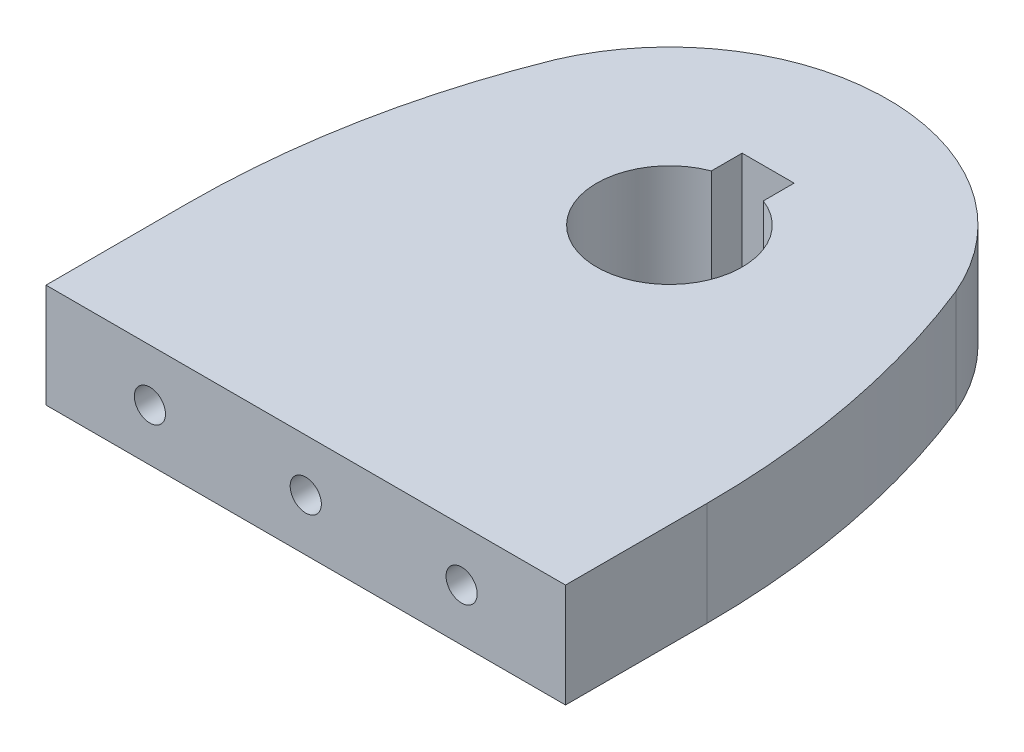
ISO-10303-21;
HEADER;
FILE_DESCRIPTION(('STEP AP214'),'2;1');
FILE_NAME('part.step','',(''),(''),'','','');
FILE_SCHEMA(('AUTOMOTIVE_DESIGN { 1 0 10303 214 1 1 1 1 }'));
ENDSEC;
DATA;
#1=APPLICATION_CONTEXT('core data for automotive mechanical design processes');
#2=APPLICATION_PROTOCOL_DEFINITION('international standard','automotive_design',2000,#1);
#3=PRODUCT_CONTEXT('',#1,'mechanical');
#4=PRODUCT('Part','Part','',(#3));
#5=PRODUCT_RELATED_PRODUCT_CATEGORY('part','',(#4));
#6=PRODUCT_DEFINITION_FORMATION('','',#4);
#7=PRODUCT_DEFINITION_CONTEXT('part definition',#1,'design');
#8=PRODUCT_DEFINITION('design','',#6,#7);
#9=PRODUCT_DEFINITION_SHAPE('','',#8);
#10=(LENGTH_UNIT() NAMED_UNIT(*) SI_UNIT(.MILLI.,.METRE.));
#11=(NAMED_UNIT(*) PLANE_ANGLE_UNIT() SI_UNIT($,.RADIAN.));
#12=(NAMED_UNIT(*) SI_UNIT($,.STERADIAN.) SOLID_ANGLE_UNIT());
#13=UNCERTAINTY_MEASURE_WITH_UNIT(LENGTH_MEASURE(1.E-05),#10,'distance_accuracy_value','');
#14=(GEOMETRIC_REPRESENTATION_CONTEXT(3) GLOBAL_UNCERTAINTY_ASSIGNED_CONTEXT((#13)) GLOBAL_UNIT_ASSIGNED_CONTEXT((#10,
#11,#12)) REPRESENTATION_CONTEXT('',''));
#15=CARTESIAN_POINT('',(0.,0.,0.));
#16=DIRECTION('',(0.,0.,1.));
#17=DIRECTION('',(1.,0.,0.));
#18=AXIS2_PLACEMENT_3D('',#15,#16,#17);
#19=CARTESIAN_POINT('',(0.,10.,-20.));
#20=DIRECTION('',(0.,-1.,0.));
#21=DIRECTION('',(0.,0.,-1.));
#22=AXIS2_PLACEMENT_3D('',#19,#20,#21);
#23=CYLINDRICAL_SURFACE('',#22,21.);
#24=CARTESIAN_POINT('',(0.,0.,-20.));
#25=DIRECTION('',(0.,1.,0.));
#26=DIRECTION('',(0.,0.,1.));
#27=AXIS2_PLACEMENT_3D('',#24,#25,#26);
#28=CIRCLE('',#27,21.);
#29=CARTESIAN_POINT('',(19.2968729091602,0.,-28.2843645458008));
#30=VERTEX_POINT('',#29);
#31=CARTESIAN_POINT('',(-19.2968729091602,0.,-28.2843645458008));
#32=VERTEX_POINT('',#31);
#33=EDGE_CURVE('E169',#30,#32,#28,.T.);
#34=ORIENTED_EDGE('',*,*,#33,.T.);
#35=DIRECTION('',(0.,-1.,0.));
#36=VECTOR('',#35,1.);
#37=CARTESIAN_POINT('',(-19.2968729091602,10.,-28.2843645458008));
#38=LINE('',#37,#36);
#39=CARTESIAN_POINT('',(-19.2968729091602,10.,-28.2843645458008));
#40=VERTEX_POINT('',#39);
#41=EDGE_CURVE('E196',#40,#32,#38,.T.);
#42=ORIENTED_EDGE('',*,*,#41,.F.);
#43=CARTESIAN_POINT('',(0.,10.,-20.));
#44=DIRECTION('',(0.,1.,0.));
#45=DIRECTION('',(0.,0.,1.));
#46=AXIS2_PLACEMENT_3D('',#43,#44,#45);
#47=CIRCLE('',#46,21.);
#48=CARTESIAN_POINT('',(19.2968729091602,10.,-28.2843645458008));
#49=VERTEX_POINT('',#48);
#50=EDGE_CURVE('E172',#49,#40,#47,.T.);
#51=ORIENTED_EDGE('',*,*,#50,.F.);
#52=DIRECTION('',(0.,-1.,0.));
#53=VECTOR('',#52,1.);
#54=CARTESIAN_POINT('',(19.2968729091602,10.,-28.2843645458008));
#55=LINE('',#54,#53);
#56=EDGE_CURVE('E199',#49,#30,#55,.T.);
#57=ORIENTED_EDGE('',*,*,#56,.T.);
#58=EDGE_LOOP('',(#34,#42,#51,#57));
#59=FACE_BOUND('',#58,.T.);
#60=ADVANCED_FACE('F38',(#59),#23,.T.);
#61=CARTESIAN_POINT('',(-25.,10.,0.));
#62=DIRECTION('',(1.,0.,0.));
#63=DIRECTION('',(0.,0.,-1.));
#64=AXIS2_PLACEMENT_3D('',#61,#62,#63);
#65=PLANE('',#64);
#66=DIRECTION('',(0.,0.,1.));
#67=VECTOR('',#66,1.);
#68=CARTESIAN_POINT('',(-25.,10.,0.));
#69=LINE('',#68,#67);
#70=CARTESIAN_POINT('',(-25.,10.,1.38000256223143));
#71=VERTEX_POINT('',#70);
#72=CARTESIAN_POINT('',(-25.,10.,15.));
#73=VERTEX_POINT('',#72);
#74=EDGE_CURVE('E174',#71,#73,#69,.T.);
#75=ORIENTED_EDGE('',*,*,#74,.F.);
#76=DIRECTION('',(0.,-1.,0.));
#77=VECTOR('',#76,1.);
#78=CARTESIAN_POINT('',(-25.,10.,1.38000256223143));
#79=LINE('',#78,#77);
#80=CARTESIAN_POINT('',(-25.,0.,1.38000256223143));
#81=VERTEX_POINT('',#80);
#82=EDGE_CURVE('E11',#71,#81,#79,.T.);
#83=ORIENTED_EDGE('',*,*,#82,.T.);
#84=DIRECTION('',(0.,0.,1.));
#85=VECTOR('',#84,1.);
#86=CARTESIAN_POINT('',(-25.,0.,0.));
#87=LINE('',#86,#85);
#88=CARTESIAN_POINT('',(-25.,0.,15.));
#89=VERTEX_POINT('',#88);
#90=EDGE_CURVE('E185',#81,#89,#87,.T.);
#91=ORIENTED_EDGE('',*,*,#90,.T.);
#92=DIRECTION('',(0.,-1.,0.));
#93=VECTOR('',#92,1.);
#94=CARTESIAN_POINT('',(-25.,10.,15.));
#95=LINE('',#94,#93);
#96=EDGE_CURVE('E193',#73,#89,#95,.T.);
#97=ORIENTED_EDGE('',*,*,#96,.F.);
#98=EDGE_LOOP('',(#75,#83,#91,#97));
#99=FACE_BOUND('',#98,.T.);
#100=ADVANCED_FACE('F222',(#99),#65,.F.);
#101=CARTESIAN_POINT('',(0.,10.,15.));
#102=DIRECTION('',(0.,0.,-1.));
#103=DIRECTION('',(-1.,0.,0.));
#104=AXIS2_PLACEMENT_3D('',#101,#102,#103);
#105=PLANE('',#104);
#106=CARTESIAN_POINT('',(15.,5.,15.));
#107=DIRECTION('',(0.,0.,1.));
#108=DIRECTION('',(1.,0.,0.));
#109=AXIS2_PLACEMENT_3D('',#106,#107,#108);
#110=CIRCLE('',#109,1.5);
#111=CARTESIAN_POINT('',(16.5,5.,15.));
#112=VERTEX_POINT('',#111);
#113=EDGE_CURVE('E153',#112,#112,#110,.T.);
#114=ORIENTED_EDGE('',*,*,#113,.F.);
#115=EDGE_LOOP('',(#114));
#116=FACE_BOUND('',#115,.T.);
#117=CARTESIAN_POINT('',(-15.,5.,15.));
#118=DIRECTION('',(0.,0.,1.));
#119=DIRECTION('',(1.,0.,0.));
#120=AXIS2_PLACEMENT_3D('',#117,#118,#119);
#121=CIRCLE('',#120,1.5);
#122=CARTESIAN_POINT('',(-13.5,5.,15.));
#123=VERTEX_POINT('',#122);
#124=EDGE_CURVE('E161',#123,#123,#121,.T.);
#125=ORIENTED_EDGE('',*,*,#124,.F.);
#126=EDGE_LOOP('',(#125));
#127=FACE_BOUND('',#126,.T.);
#128=CARTESIAN_POINT('',(0.,5.,15.));
#129=DIRECTION('',(0.,0.,1.));
#130=DIRECTION('',(1.,0.,0.));
#131=AXIS2_PLACEMENT_3D('',#128,#129,#130);
#132=CIRCLE('',#131,1.5);
#133=CARTESIAN_POINT('',(1.5,5.,15.));
#134=VERTEX_POINT('',#133);
#135=EDGE_CURVE('E160',#134,#134,#132,.T.);
#136=ORIENTED_EDGE('',*,*,#135,.F.);
#137=EDGE_LOOP('',(#136));
#138=FACE_BOUND('',#137,.T.);
#139=DIRECTION('',(1.,0.,0.));
#140=VECTOR('',#139,1.);
#141=CARTESIAN_POINT('',(0.,0.,15.));
#142=LINE('',#141,#140);
#143=CARTESIAN_POINT('',(25.,0.,15.));
#144=VERTEX_POINT('',#143);
#145=EDGE_CURVE('E187',#89,#144,#142,.T.);
#146=ORIENTED_EDGE('',*,*,#145,.T.);
#147=DIRECTION('',(0.,-1.,0.));
#148=VECTOR('',#147,1.);
#149=CARTESIAN_POINT('',(25.,10.,15.));
#150=LINE('',#149,#148);
#151=CARTESIAN_POINT('',(25.,10.,15.));
#152=VERTEX_POINT('',#151);
#153=EDGE_CURVE('E182',#152,#144,#150,.T.);
#154=ORIENTED_EDGE('',*,*,#153,.F.);
#155=DIRECTION('',(1.,0.,0.));
#156=VECTOR('',#155,1.);
#157=CARTESIAN_POINT('',(0.,10.,15.));
#158=LINE('',#157,#156);
#159=EDGE_CURVE('E177',#73,#152,#158,.T.);
#160=ORIENTED_EDGE('',*,*,#159,.F.);
#161=ORIENTED_EDGE('',*,*,#96,.T.);
#162=EDGE_LOOP('',(#146,#154,#160,#161));
#163=FACE_BOUND('',#162,.T.);
#164=ADVANCED_FACE('F227',(#116,#127,#138,#163),#105,.F.);
#165=CARTESIAN_POINT('',(25.,10.,0.));
#166=DIRECTION('',(1.,0.,0.));
#167=DIRECTION('',(0.,0.,-1.));
#168=AXIS2_PLACEMENT_3D('',#165,#166,#167);
#169=PLANE('',#168);
#170=DIRECTION('',(0.,0.,1.));
#171=VECTOR('',#170,1.);
#172=CARTESIAN_POINT('',(25.,0.,0.));
#173=LINE('',#172,#171);
#174=CARTESIAN_POINT('',(25.,0.,1.38000256223146));
#175=VERTEX_POINT('',#174);
#176=EDGE_CURVE('E175',#175,#144,#173,.T.);
#177=ORIENTED_EDGE('',*,*,#176,.F.);
#178=DIRECTION('',(0.,1.,0.));
#179=VECTOR('',#178,1.);
#180=CARTESIAN_POINT('',(25.,10.,1.38000256223146));
#181=LINE('',#180,#179);
#182=CARTESIAN_POINT('',(25.,10.,1.38000256223146));
#183=VERTEX_POINT('',#182);
#184=EDGE_CURVE('E61',#175,#183,#181,.T.);
#185=ORIENTED_EDGE('',*,*,#184,.T.);
#186=DIRECTION('',(0.,0.,1.));
#187=VECTOR('',#186,1.);
#188=CARTESIAN_POINT('',(25.,10.,0.));
#189=LINE('',#188,#187);
#190=EDGE_CURVE('E180',#183,#152,#189,.T.);
#191=ORIENTED_EDGE('',*,*,#190,.T.);
#192=ORIENTED_EDGE('',*,*,#153,.T.);
#193=EDGE_LOOP('',(#177,#185,#191,#192));
#194=FACE_BOUND('',#193,.T.);
#195=ADVANCED_FACE('F229',(#194),#169,.T.);
#196=CARTESIAN_POINT('',(0.,10.,0.));
#197=DIRECTION('',(0.,1.,0.));
#198=DIRECTION('',(0.,0.,1.));
#199=AXIS2_PLACEMENT_3D('',#196,#197,#198);
#200=PLANE('',#199);
#201=ORIENTED_EDGE('',*,*,#190,.F.);
#202=CARTESIAN_POINT('',(-55.,10.,1.38000256223148));
#203=DIRECTION('',(0.,1.,0.));
#204=DIRECTION('',(0.,0.,1.));
#205=AXIS2_PLACEMENT_3D('',#202,#203,#204);
#206=CIRCLE('',#205,80.);
#207=EDGE_CURVE('E46',#183,#49,#206,.T.);
#208=ORIENTED_EDGE('',*,*,#207,.T.);
#209=ORIENTED_EDGE('',*,*,#50,.T.);
#210=CARTESIAN_POINT('',(55.,10.,1.38000256223141));
#211=DIRECTION('',(0.,1.,0.));
#212=DIRECTION('',(0.,0.,1.));
#213=AXIS2_PLACEMENT_3D('',#210,#211,#212);
#214=CIRCLE('',#213,80.);
#215=EDGE_CURVE('E53',#40,#71,#214,.T.);
#216=ORIENTED_EDGE('',*,*,#215,.T.);
#217=ORIENTED_EDGE('',*,*,#74,.T.);
#218=ORIENTED_EDGE('',*,*,#159,.T.);
#219=EDGE_LOOP('',(#201,#208,#209,#216,#217,#218));
#220=FACE_BOUND('',#219,.T.);
#221=CARTESIAN_POINT('',(0.,10.,-20.));
#222=DIRECTION('',(0.,1.,0.));
#223=DIRECTION('',(0.,0.,1.));
#224=AXIS2_PLACEMENT_3D('',#221,#222,#223);
#225=CIRCLE('',#224,7.);
#226=CARTESIAN_POINT('',(-2.5,10.,-26.538348415311));
#227=VERTEX_POINT('',#226);
#228=CARTESIAN_POINT('',(2.5,10.,-26.538348415311));
#229=VERTEX_POINT('',#228);
#230=EDGE_CURVE('E122',#227,#229,#225,.T.);
#231=ORIENTED_EDGE('',*,*,#230,.F.);
#232=DIRECTION('',(0.,0.,1.));
#233=VECTOR('',#232,1.);
#234=CARTESIAN_POINT('',(-2.5,10.,0.));
#235=LINE('',#234,#233);
#236=CARTESIAN_POINT('',(-2.5,10.,-29.5));
#237=VERTEX_POINT('',#236);
#238=EDGE_CURVE('E131',#237,#227,#235,.T.);
#239=ORIENTED_EDGE('',*,*,#238,.F.);
#240=DIRECTION('',(1.,0.,0.));
#241=VECTOR('',#240,1.);
#242=CARTESIAN_POINT('',(0.,10.,-29.5));
#243=LINE('',#242,#241);
#244=CARTESIAN_POINT('',(2.5,10.,-29.5));
#245=VERTEX_POINT('',#244);
#246=EDGE_CURVE('E137',#237,#245,#243,.T.);
#247=ORIENTED_EDGE('',*,*,#246,.T.);
#248=DIRECTION('',(0.,0.,1.));
#249=VECTOR('',#248,1.);
#250=CARTESIAN_POINT('',(2.5,10.,0.));
#251=LINE('',#250,#249);
#252=EDGE_CURVE('E128',#245,#229,#251,.T.);
#253=ORIENTED_EDGE('',*,*,#252,.T.);
#254=EDGE_LOOP('',(#231,#239,#247,#253));
#255=FACE_BOUND('',#254,.T.);
#256=ADVANCED_FACE('F139',(#220,#255),#200,.T.);
#257=CARTESIAN_POINT('',(0.,0.,0.));
#258=DIRECTION('',(0.,1.,0.));
#259=DIRECTION('',(0.,0.,1.));
#260=AXIS2_PLACEMENT_3D('',#257,#258,#259);
#261=PLANE('',#260);
#262=ORIENTED_EDGE('',*,*,#33,.F.);
#263=CARTESIAN_POINT('',(-55.,0.,1.38000256223148));
#264=DIRECTION('',(0.,1.,0.));
#265=DIRECTION('',(0.,0.,1.));
#266=AXIS2_PLACEMENT_3D('',#263,#264,#265);
#267=CIRCLE('',#266,80.);
#268=EDGE_CURVE('E204',#30,#175,#267,.F.);
#269=ORIENTED_EDGE('',*,*,#268,.T.);
#270=ORIENTED_EDGE('',*,*,#176,.T.);
#271=ORIENTED_EDGE('',*,*,#145,.F.);
#272=ORIENTED_EDGE('',*,*,#90,.F.);
#273=CARTESIAN_POINT('',(55.,0.,1.38000256223141));
#274=DIRECTION('',(0.,1.,0.));
#275=DIRECTION('',(0.,0.,1.));
#276=AXIS2_PLACEMENT_3D('',#273,#274,#275);
#277=CIRCLE('',#276,80.);
#278=EDGE_CURVE('E202',#81,#32,#277,.F.);
#279=ORIENTED_EDGE('',*,*,#278,.T.);
#280=EDGE_LOOP('',(#262,#269,#270,#271,#272,#279));
#281=FACE_BOUND('',#280,.T.);
#282=DIRECTION('',(0.,0.,-1.));
#283=VECTOR('',#282,1.);
#284=CARTESIAN_POINT('',(2.5,0.,0.));
#285=LINE('',#284,#283);
#286=CARTESIAN_POINT('',(2.5,0.,-26.538348415311));
#287=VERTEX_POINT('',#286);
#288=CARTESIAN_POINT('',(2.5,0.,-29.5));
#289=VERTEX_POINT('',#288);
#290=EDGE_CURVE('E293',#287,#289,#285,.T.);
#291=ORIENTED_EDGE('',*,*,#290,.T.);
#292=DIRECTION('',(-1.,0.,0.));
#293=VECTOR('',#292,1.);
#294=CARTESIAN_POINT('',(0.,0.,-29.5));
#295=LINE('',#294,#293);
#296=CARTESIAN_POINT('',(-2.5,0.,-29.5));
#297=VERTEX_POINT('',#296);
#298=EDGE_CURVE('E295',#289,#297,#295,.T.);
#299=ORIENTED_EDGE('',*,*,#298,.T.);
#300=DIRECTION('',(0.,0.,-1.));
#301=VECTOR('',#300,1.);
#302=CARTESIAN_POINT('',(-2.5,0.,0.));
#303=LINE('',#302,#301);
#304=CARTESIAN_POINT('',(-2.5,0.,-26.538348415311));
#305=VERTEX_POINT('',#304);
#306=EDGE_CURVE('E149',#305,#297,#303,.T.);
#307=ORIENTED_EDGE('',*,*,#306,.F.);
#308=CARTESIAN_POINT('',(0.,0.,-20.));
#309=DIRECTION('',(0.,1.,0.));
#310=DIRECTION('',(0.,0.,1.));
#311=AXIS2_PLACEMENT_3D('',#308,#309,#310);
#312=CIRCLE('',#311,7.);
#313=EDGE_CURVE('E124',#287,#305,#312,.F.);
#314=ORIENTED_EDGE('',*,*,#313,.F.);
#315=EDGE_LOOP('',(#291,#299,#307,#314));
#316=FACE_BOUND('',#315,.T.);
#317=ADVANCED_FACE('F216',(#281,#316),#261,.F.);
#318=CARTESIAN_POINT('',(-55.,10.,1.38000256223148));
#319=DIRECTION('',(0.,-1.,0.));
#320=DIRECTION('',(0.,0.,-1.));
#321=AXIS2_PLACEMENT_3D('',#318,#319,#320);
#322=CYLINDRICAL_SURFACE('',#321,80.);
#323=ORIENTED_EDGE('',*,*,#207,.F.);
#324=ORIENTED_EDGE('',*,*,#184,.F.);
#325=ORIENTED_EDGE('',*,*,#268,.F.);
#326=ORIENTED_EDGE('',*,*,#56,.F.);
#327=EDGE_LOOP('',(#323,#324,#325,#326));
#328=FACE_BOUND('',#327,.T.);
#329=ADVANCED_FACE('F213',(#328),#322,.T.);
#330=CARTESIAN_POINT('',(55.,10.,1.38000256223141));
#331=DIRECTION('',(0.,-1.,0.));
#332=DIRECTION('',(0.,0.,-1.));
#333=AXIS2_PLACEMENT_3D('',#330,#331,#332);
#334=CYLINDRICAL_SURFACE('',#333,80.);
#335=ORIENTED_EDGE('',*,*,#215,.F.);
#336=ORIENTED_EDGE('',*,*,#41,.T.);
#337=ORIENTED_EDGE('',*,*,#278,.F.);
#338=ORIENTED_EDGE('',*,*,#82,.F.);
#339=EDGE_LOOP('',(#335,#336,#337,#338));
#340=FACE_BOUND('',#339,.T.);
#341=ADVANCED_FACE('F40',(#340),#334,.T.);
#342=CARTESIAN_POINT('',(0.,5.,0.));
#343=DIRECTION('',(0.,0.,1.));
#344=DIRECTION('',(1.,0.,0.));
#345=AXIS2_PLACEMENT_3D('',#342,#343,#344);
#346=CYLINDRICAL_SURFACE('',#345,1.5);
#347=CARTESIAN_POINT('',(0.,5.,0.));
#348=DIRECTION('',(0.,0.,1.));
#349=DIRECTION('',(1.,0.,0.));
#350=AXIS2_PLACEMENT_3D('',#347,#348,#349);
#351=CIRCLE('',#350,1.5);
#352=CARTESIAN_POINT('',(1.5,5.,0.));
#353=VERTEX_POINT('',#352);
#354=EDGE_CURVE('E166',#353,#353,#351,.T.);
#355=ORIENTED_EDGE('',*,*,#354,.F.);
#356=EDGE_LOOP('',(#355));
#357=FACE_BOUND('',#356,.T.);
#358=ORIENTED_EDGE('',*,*,#135,.T.);
#359=EDGE_LOOP('',(#358));
#360=FACE_BOUND('',#359,.T.);
#361=ADVANCED_FACE('F251',(#357,#360),#346,.F.);
#362=CARTESIAN_POINT('',(0.,5.,0.));
#363=DIRECTION('',(0.,0.,1.));
#364=DIRECTION('',(1.,0.,0.));
#365=AXIS2_PLACEMENT_3D('',#362,#363,#364);
#366=PLANE('',#365);
#367=ORIENTED_EDGE('',*,*,#354,.T.);
#368=EDGE_LOOP('',(#367));
#369=FACE_BOUND('',#368,.T.);
#370=ADVANCED_FACE('F257',(#369),#366,.T.);
#371=CARTESIAN_POINT('',(-15.,5.,0.));
#372=DIRECTION('',(0.,0.,1.));
#373=DIRECTION('',(1.,0.,0.));
#374=AXIS2_PLACEMENT_3D('',#371,#372,#373);
#375=CYLINDRICAL_SURFACE('',#374,1.5);
#376=CARTESIAN_POINT('',(-15.,5.,0.));
#377=DIRECTION('',(0.,0.,1.));
#378=DIRECTION('',(1.,0.,0.));
#379=AXIS2_PLACEMENT_3D('',#376,#377,#378);
#380=CIRCLE('',#379,1.5);
#381=CARTESIAN_POINT('',(-13.5,5.,0.));
#382=VERTEX_POINT('',#381);
#383=EDGE_CURVE('E157',#382,#382,#380,.T.);
#384=ORIENTED_EDGE('',*,*,#383,.F.);
#385=EDGE_LOOP('',(#384));
#386=FACE_BOUND('',#385,.T.);
#387=ORIENTED_EDGE('',*,*,#124,.T.);
#388=EDGE_LOOP('',(#387));
#389=FACE_BOUND('',#388,.T.);
#390=ADVANCED_FACE('F261',(#386,#389),#375,.F.);
#391=CARTESIAN_POINT('',(-15.,5.,0.));
#392=DIRECTION('',(0.,0.,1.));
#393=DIRECTION('',(1.,0.,0.));
#394=AXIS2_PLACEMENT_3D('',#391,#392,#393);
#395=PLANE('',#394);
#396=ORIENTED_EDGE('',*,*,#383,.T.);
#397=EDGE_LOOP('',(#396));
#398=FACE_BOUND('',#397,.T.);
#399=ADVANCED_FACE('F265',(#398),#395,.T.);
#400=CARTESIAN_POINT('',(15.,5.,0.));
#401=DIRECTION('',(0.,0.,1.));
#402=DIRECTION('',(1.,0.,0.));
#403=AXIS2_PLACEMENT_3D('',#400,#401,#402);
#404=CYLINDRICAL_SURFACE('',#403,1.5);
#405=CARTESIAN_POINT('',(15.,5.,0.));
#406=DIRECTION('',(0.,0.,1.));
#407=DIRECTION('',(1.,0.,0.));
#408=AXIS2_PLACEMENT_3D('',#405,#406,#407);
#409=CIRCLE('',#408,1.5);
#410=CARTESIAN_POINT('',(16.5,5.,0.));
#411=VERTEX_POINT('',#410);
#412=EDGE_CURVE('E156',#411,#411,#409,.T.);
#413=ORIENTED_EDGE('',*,*,#412,.F.);
#414=EDGE_LOOP('',(#413));
#415=FACE_BOUND('',#414,.T.);
#416=ORIENTED_EDGE('',*,*,#113,.T.);
#417=EDGE_LOOP('',(#416));
#418=FACE_BOUND('',#417,.T.);
#419=ADVANCED_FACE('F269',(#415,#418),#404,.F.);
#420=CARTESIAN_POINT('',(15.,5.,0.));
#421=DIRECTION('',(0.,0.,1.));
#422=DIRECTION('',(1.,0.,0.));
#423=AXIS2_PLACEMENT_3D('',#420,#421,#422);
#424=PLANE('',#423);
#425=ORIENTED_EDGE('',*,*,#412,.T.);
#426=EDGE_LOOP('',(#425));
#427=FACE_BOUND('',#426,.T.);
#428=ADVANCED_FACE('F273',(#427),#424,.T.);
#429=CARTESIAN_POINT('',(-2.5,-45.254833995939,0.));
#430=DIRECTION('',(-1.,0.,0.));
#431=DIRECTION('',(0.,0.,1.));
#432=AXIS2_PLACEMENT_3D('',#429,#430,#431);
#433=PLANE('',#432);
#434=DIRECTION('',(0.,1.,0.));
#435=VECTOR('',#434,1.);
#436=CARTESIAN_POINT('',(-2.5,-45.254833995939,-26.538348415311));
#437=LINE('',#436,#435);
#438=EDGE_CURVE('E117',#305,#227,#437,.T.);
#439=ORIENTED_EDGE('',*,*,#438,.F.);
#440=ORIENTED_EDGE('',*,*,#306,.T.);
#441=DIRECTION('',(0.,1.,0.));
#442=VECTOR('',#441,1.);
#443=CARTESIAN_POINT('',(-2.5,-45.254833995939,-29.5));
#444=LINE('',#443,#442);
#445=EDGE_CURVE('E127',#297,#237,#444,.T.);
#446=ORIENTED_EDGE('',*,*,#445,.T.);
#447=ORIENTED_EDGE('',*,*,#238,.T.);
#448=EDGE_LOOP('',(#439,#440,#446,#447));
#449=FACE_BOUND('',#448,.T.);
#450=ADVANCED_FACE('F132',(#449),#433,.F.);
#451=CARTESIAN_POINT('',(0.,-45.254833995939,-29.5));
#452=DIRECTION('',(0.,0.,1.));
#453=DIRECTION('',(1.,0.,0.));
#454=AXIS2_PLACEMENT_3D('',#451,#452,#453);
#455=PLANE('',#454);
#456=ORIENTED_EDGE('',*,*,#298,.F.);
#457=DIRECTION('',(0.,1.,0.));
#458=VECTOR('',#457,1.);
#459=CARTESIAN_POINT('',(2.5,-45.254833995939,-29.5));
#460=LINE('',#459,#458);
#461=EDGE_CURVE('E150',#289,#245,#460,.T.);
#462=ORIENTED_EDGE('',*,*,#461,.T.);
#463=ORIENTED_EDGE('',*,*,#246,.F.);
#464=ORIENTED_EDGE('',*,*,#445,.F.);
#465=EDGE_LOOP('',(#456,#462,#463,#464));
#466=FACE_BOUND('',#465,.T.);
#467=ADVANCED_FACE('F283',(#466),#455,.T.);
#468=CARTESIAN_POINT('',(2.5,-45.254833995939,0.));
#469=DIRECTION('',(-1.,0.,0.));
#470=DIRECTION('',(0.,0.,1.));
#471=AXIS2_PLACEMENT_3D('',#468,#469,#470);
#472=PLANE('',#471);
#473=ORIENTED_EDGE('',*,*,#290,.F.);
#474=DIRECTION('',(0.,1.,0.));
#475=VECTOR('',#474,1.);
#476=CARTESIAN_POINT('',(2.5,-45.254833995939,-26.538348415311));
#477=LINE('',#476,#475);
#478=EDGE_CURVE('E147',#287,#229,#477,.T.);
#479=ORIENTED_EDGE('',*,*,#478,.T.);
#480=ORIENTED_EDGE('',*,*,#252,.F.);
#481=ORIENTED_EDGE('',*,*,#461,.F.);
#482=EDGE_LOOP('',(#473,#479,#480,#481));
#483=FACE_BOUND('',#482,.T.);
#484=ADVANCED_FACE('F280',(#483),#472,.T.);
#485=CARTESIAN_POINT('',(0.,-45.254833995939,-20.));
#486=DIRECTION('',(0.,1.,0.));
#487=DIRECTION('',(0.,0.,1.));
#488=AXIS2_PLACEMENT_3D('',#485,#486,#487);
#489=CYLINDRICAL_SURFACE('',#488,7.);
#490=ORIENTED_EDGE('',*,*,#478,.F.);
#491=ORIENTED_EDGE('',*,*,#313,.T.);
#492=ORIENTED_EDGE('',*,*,#438,.T.);
#493=ORIENTED_EDGE('',*,*,#230,.T.);
#494=EDGE_LOOP('',(#490,#491,#492,#493));
#495=FACE_BOUND('',#494,.T.);
#496=ADVANCED_FACE('F120',(#495),#489,.F.);
#497=CLOSED_SHELL('',(#60,#100,#164,#195,#256,#317,#329,#341,#361,#370,#390,#399,#419,#428,#450,
#467,#484,#496));
#498=MANIFOLD_SOLID_BREP('B2',#497);
#499=ADVANCED_BREP_SHAPE_REPRESENTATION('',(#18,#498),#14);
#500=SHAPE_DEFINITION_REPRESENTATION(#9,#499);
ENDSEC;
END-ISO-10303-21;
